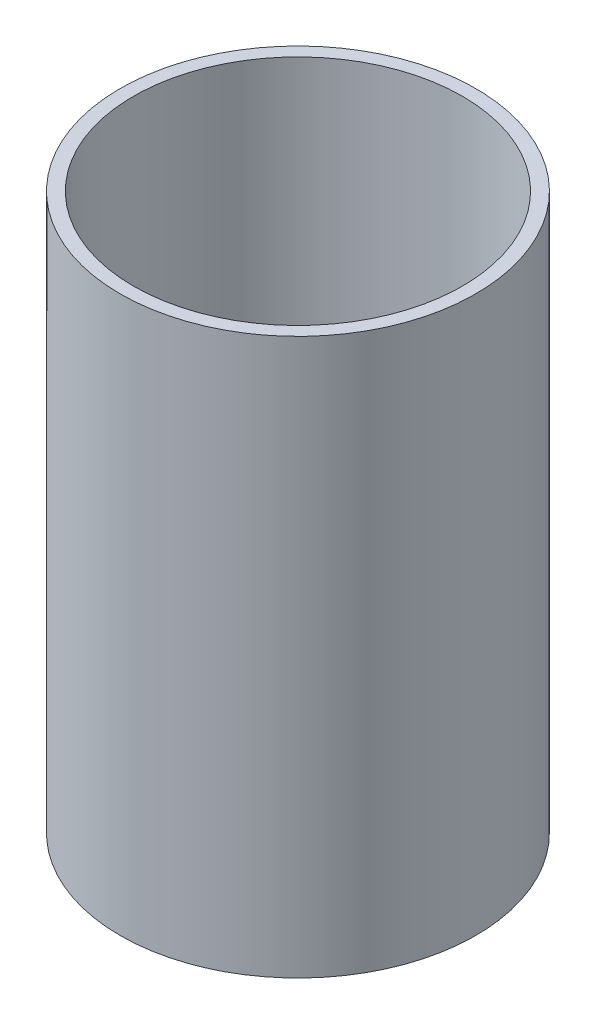
ISO-10303-21;
HEADER;
FILE_DESCRIPTION(('STEP AP214'),'2;1');
FILE_NAME('part.step','',(''),(''),'','','');
FILE_SCHEMA(('AUTOMOTIVE_DESIGN { 1 0 10303 214 1 1 1 1 }'));
ENDSEC;
DATA;
#1=APPLICATION_CONTEXT('core data for automotive mechanical design processes');
#2=APPLICATION_PROTOCOL_DEFINITION('international standard','automotive_design',2000,#1);
#3=PRODUCT_CONTEXT('',#1,'mechanical');
#4=PRODUCT('Part','Part','',(#3));
#5=PRODUCT_RELATED_PRODUCT_CATEGORY('part','',(#4));
#6=PRODUCT_DEFINITION_FORMATION('','',#4);
#7=PRODUCT_DEFINITION_CONTEXT('part definition',#1,'design');
#8=PRODUCT_DEFINITION('design','',#6,#7);
#9=PRODUCT_DEFINITION_SHAPE('','',#8);
#10=(LENGTH_UNIT() NAMED_UNIT(*) SI_UNIT(.MILLI.,.METRE.));
#11=(NAMED_UNIT(*) PLANE_ANGLE_UNIT() SI_UNIT($,.RADIAN.));
#12=(NAMED_UNIT(*) SI_UNIT($,.STERADIAN.) SOLID_ANGLE_UNIT());
#13=UNCERTAINTY_MEASURE_WITH_UNIT(LENGTH_MEASURE(1.E-05),#10,'distance_accuracy_value','');
#14=(GEOMETRIC_REPRESENTATION_CONTEXT(3) GLOBAL_UNCERTAINTY_ASSIGNED_CONTEXT((#13)) GLOBAL_UNIT_ASSIGNED_CONTEXT((#10,
#11,#12)) REPRESENTATION_CONTEXT('',''));
#15=CARTESIAN_POINT('',(0.,0.,0.));
#16=DIRECTION('',(0.,0.,1.));
#17=DIRECTION('',(1.,0.,0.));
#18=AXIS2_PLACEMENT_3D('',#15,#16,#17);
#19=CARTESIAN_POINT('',(0.,50.,0.));
#20=DIRECTION('',(0.,1.,0.));
#21=DIRECTION('',(0.,0.,1.));
#22=AXIS2_PLACEMENT_3D('',#19,#20,#21);
#23=PLANE('',#22);
#24=CARTESIAN_POINT('',(0.,50.,0.));
#25=DIRECTION('',(0.,1.,0.));
#26=DIRECTION('',(0.,0.,1.));
#27=AXIS2_PLACEMENT_3D('',#24,#25,#26);
#28=CIRCLE('',#27,16.);
#29=CARTESIAN_POINT('',(0.,50.,16.));
#30=VERTEX_POINT('',#29);
#31=EDGE_CURVE('E13',#30,#30,#28,.T.);
#32=ORIENTED_EDGE('',*,*,#31,.T.);
#33=EDGE_LOOP('',(#32));
#34=FACE_BOUND('',#33,.T.);
#35=CARTESIAN_POINT('',(0.,50.,0.));
#36=DIRECTION('',(0.,1.,0.));
#37=DIRECTION('',(0.,0.,1.));
#38=AXIS2_PLACEMENT_3D('',#35,#36,#37);
#39=CIRCLE('',#38,14.8);
#40=CARTESIAN_POINT('',(0.,50.,14.8));
#41=VERTEX_POINT('',#40);
#42=EDGE_CURVE('E111',#41,#41,#39,.T.);
#43=ORIENTED_EDGE('',*,*,#42,.F.);
#44=EDGE_LOOP('',(#43));
#45=FACE_BOUND('',#44,.T.);
#46=ADVANCED_FACE('F46',(#34,#45),#23,.T.);
#47=CARTESIAN_POINT('',(0.,0.,0.));
#48=DIRECTION('',(0.,1.,0.));
#49=DIRECTION('',(0.,0.,1.));
#50=AXIS2_PLACEMENT_3D('',#47,#48,#49);
#51=PLANE('',#50);
#52=CARTESIAN_POINT('',(0.,0.,0.));
#53=DIRECTION('',(0.,1.,0.));
#54=DIRECTION('',(0.,0.,1.));
#55=AXIS2_PLACEMENT_3D('',#52,#53,#54);
#56=CIRCLE('',#55,16.);
#57=CARTESIAN_POINT('',(0.,0.,16.));
#58=VERTEX_POINT('',#57);
#59=EDGE_CURVE('E57',#58,#58,#56,.T.);
#60=ORIENTED_EDGE('',*,*,#59,.F.);
#61=EDGE_LOOP('',(#60));
#62=FACE_BOUND('',#61,.T.);
#63=CARTESIAN_POINT('',(0.,0.,0.));
#64=DIRECTION('',(0.,1.,0.));
#65=DIRECTION('',(0.,0.,1.));
#66=AXIS2_PLACEMENT_3D('',#63,#64,#65);
#67=CIRCLE('',#66,14.8);
#68=CARTESIAN_POINT('',(0.,0.,14.8));
#69=VERTEX_POINT('',#68);
#70=EDGE_CURVE('E75',#69,#69,#67,.T.);
#71=ORIENTED_EDGE('',*,*,#70,.T.);
#72=EDGE_LOOP('',(#71));
#73=FACE_BOUND('',#72,.T.);
#74=ADVANCED_FACE('F122',(#62,#73),#51,.F.);
#75=CARTESIAN_POINT('',(0.,50.,0.));
#76=DIRECTION('',(0.,-1.,0.));
#77=DIRECTION('',(0.,0.,-1.));
#78=AXIS2_PLACEMENT_3D('',#75,#76,#77);
#79=CYLINDRICAL_SURFACE('',#78,16.);
#80=CARTESIAN_POINT('',(-16.,25.5,0.));
#81=CARTESIAN_POINT('',(-16.000000022161,25.5000003187984,0.00854419738761275));
#82=CARTESIAN_POINT('',(-15.9999931564576,25.4998130099911,0.0170893455640796));
#83=CARTESIAN_POINT('',(-15.9999660260618,25.4990511193298,0.0340217371802799));
#84=CARTESIAN_POINT('',(-15.9999459829687,25.4984829393989,0.042409271871736));
#85=CARTESIAN_POINT('',(-15.9998932472506,25.4969595173938,0.0590266862545256));
#86=CARTESIAN_POINT('',(-15.9998607424584,25.4960100132974,0.0672570871649991));
#87=CARTESIAN_POINT('',(-15.9997838534631,25.4937247592253,0.0835598397620271));
#88=CARTESIAN_POINT('',(-15.9997396220718,25.4923939611432,0.0916328838903904));
#89=CARTESIAN_POINT('',(-15.9996400278649,25.4893469225403,0.107620788280474));
#90=CARTESIAN_POINT('',(-15.9995847830799,25.4876347481539,0.115536422157899));
#91=CARTESIAN_POINT('',(-15.9994638980031,25.4838258910626,0.131209417614169));
#92=CARTESIAN_POINT('',(-15.9993983420339,25.4817323071844,0.138967531747529));
#93=CARTESIAN_POINT('',(-15.9992575545361,25.4771616313094,0.154325520551644));
#94=CARTESIAN_POINT('',(-15.9991823757573,25.4746866161569,0.161926013228417));
#95=CARTESIAN_POINT('',(-15.9990230463243,25.4693541261713,0.176968906553041));
#96=CARTESIAN_POINT('',(-15.9989389199814,25.4664976825634,0.184411672867422));
#97=CARTESIAN_POINT('',(-15.998762381644,25.4604033964034,0.199139382356899));
#98=CARTESIAN_POINT('',(-15.998669969555,25.4571655495002,0.206424323730403));
#99=CARTESIAN_POINT('',(-15.9984775276848,25.4503094958122,0.220836767729123));
#100=CARTESIAN_POINT('',(-15.9983774781479,25.4466902927126,0.227963795983825));
#101=CARTESIAN_POINT('',(-15.9981704104108,25.4390725099795,0.242060901892044));
#102=CARTESIAN_POINT('',(-15.9980633580033,25.4350720164771,0.249029944209711));
#103=CARTESIAN_POINT('',(-15.9978429142773,25.426692551113,0.262811650842644));
#104=CARTESIAN_POINT('',(-15.9977294796947,25.4223108479036,0.269622652399459));
#105=CARTESIAN_POINT('',(-15.9974968819047,25.4131697505162,0.28308891331842));
#106=CARTESIAN_POINT('',(-15.9973776716728,25.408406926401,0.289741841241404));
#107=CARTESIAN_POINT('',(-15.9971341139852,25.3985042535724,0.302892619724633));
#108=CARTESIAN_POINT('',(-15.9970097206926,25.3933604064378,0.309387454993219));
#109=CARTESIAN_POINT('',(-15.9967563683747,25.382696200712,0.322222746698452));
#110=CARTESIAN_POINT('',(-15.9966273690714,25.3771714085011,0.328559514270795));
#111=CARTESIAN_POINT('',(-15.9963653625106,25.3657457620264,0.341079260200018));
#112=CARTESIAN_POINT('',(-15.9962323242938,25.3598401702685,0.347257906702018));
#113=CARTESIAN_POINT('',(-15.995965104725,25.347758824547,0.359356318050322));
#114=CARTESIAN_POINT('',(-15.995830922448,25.341582831105,0.365275843737312));
#115=CARTESIAN_POINT('',(-15.9955652510334,25.3290678170494,0.376728792292628));
#116=CARTESIAN_POINT('',(-15.995433753916,25.3227331520779,0.382266966075001));
#117=CARTESIAN_POINT('',(-15.9951746685603,25.3099014704081,0.392957366584713));
#118=CARTESIAN_POINT('',(-15.9950470512844,25.3034081643703,0.398114041176149));
#119=CARTESIAN_POINT('',(-15.9947968482523,25.2902598598075,0.408041829027736));
#120=CARTESIAN_POINT('',(-15.9946742195514,25.283607895412,0.412816954802194));
#121=CARTESIAN_POINT('',(-15.9944350284272,25.2701429785383,0.42198213662288));
#122=CARTESIAN_POINT('',(-15.9943184167316,25.2633323731124,0.426375636065839));
#123=CARTESIAN_POINT('',(-15.9940922045334,25.2495508785582,0.434778198258726));
#124=CARTESIAN_POINT('',(-15.9939825562378,25.2425816643081,0.438790004513));
#125=CARTESIAN_POINT('',(-15.9937711262381,25.2284836354514,0.446429939693773));
#126=CARTESIAN_POINT('',(-15.9936693058566,25.2213558647338,0.450059992692729));
#127=CARTESIAN_POINT('',(-15.9934742977766,25.2069413565834,0.456937295402938));
#128=CARTESIAN_POINT('',(-15.9933810875823,25.1996550986081,0.460185549065969));
#129=CARTESIAN_POINT('',(-15.9932039774208,25.1849241747372,0.466300219481753));
#130=CARTESIAN_POINT('',(-15.9931200772366,25.1774795125409,0.469166645140295));
#131=CARTESIAN_POINT('',(-15.9929621772057,25.1624322426394,0.474518690189638));
#132=CARTESIAN_POINT('',(-15.9928882042066,25.1548292684014,0.477003279454266));
#133=CARTESIAN_POINT('',(-15.9927506626633,25.139465724794,0.481592713834051));
#134=CARTESIAN_POINT('',(-15.9926871512568,25.1317045343144,0.483695479551824));
#135=CARTESIAN_POINT('',(-15.992570952671,25.1160247890639,0.487522325762574));
#136=CARTESIAN_POINT('',(-15.9925183544561,25.1081054770057,0.489243301195504));
#137=CARTESIAN_POINT('',(-15.9924243194103,25.0921095966818,0.492307588840854));
#138=CARTESIAN_POINT('',(-15.9923830032194,25.0840322488844,0.493646825249004));
#139=CARTESIAN_POINT('',(-15.9923117884386,25.0677202992437,0.495948589392911));
#140=CARTESIAN_POINT('',(-15.9922820404495,25.0594849990285,0.496906152062965));
#141=CARTESIAN_POINT('',(-15.99223413886,25.0428570146902,0.498445431843923));
#142=CARTESIAN_POINT('',(-15.9922161627631,25.034463800945,0.499021396439908));
#143=CARTESIAN_POINT('',(-15.9921919035581,25.0175198917864,0.499798230430733));
#144=CARTESIAN_POINT('',(-15.9921858207397,25.0089689072466,0.499992674995636));
#145=CARTESIAN_POINT('',(-15.9921853735323,24.9918635521172,0.500006978516785));
#146=CARTESIAN_POINT('',(-15.992191013354,24.9833091814148,0.499826702878929));
#147=CARTESIAN_POINT('',(-15.9922144052116,24.966358007453,0.499077707362123));
#148=CARTESIAN_POINT('',(-15.992231956641,24.9579609253767,0.498515420862722));
#149=CARTESIAN_POINT('',(-15.9922790307901,24.9413247129481,0.497002984285436));
#150=CARTESIAN_POINT('',(-15.992308375657,24.9330850617688,0.496058595196808));
#151=CARTESIAN_POINT('',(-15.9923788085461,24.9167639204705,0.493782669284477));
#152=CARTESIAN_POINT('',(-15.9924197456204,24.9086817391578,0.49245610532357));
#153=CARTESIAN_POINT('',(-15.9925130491462,24.8926757037231,0.489416653498954));
#154=CARTESIAN_POINT('',(-15.9925652946367,24.8847510755998,0.487707848273403));
#155=CARTESIAN_POINT('',(-15.9926808165682,24.8690602118382,0.483904834790657));
#156=CARTESIAN_POINT('',(-15.9927440037755,24.8612932228332,0.481813737112032));
#157=CARTESIAN_POINT('',(-15.9928809275667,24.8459175974256,0.4772471325227));
#158=CARTESIAN_POINT('',(-15.9929546068173,24.8383083423323,0.474773708909914));
#159=CARTESIAN_POINT('',(-15.99311195161,24.8232480274751,0.469443490638924));
#160=CARTESIAN_POINT('',(-15.993195590201,24.8157966022696,0.466587728140051));
#161=CARTESIAN_POINT('',(-15.9933722108168,24.8010516704421,0.460493881478012));
#162=CARTESIAN_POINT('',(-15.9934651930595,24.7937581675063,0.457255788401966));
#163=CARTESIAN_POINT('',(-15.9936597800336,24.7793286885719,0.450398306390711));
#164=CARTESIAN_POINT('',(-15.9937614073722,24.772193191169,0.446777911371452));
#165=CARTESIAN_POINT('',(-15.9939724870204,24.7580792288502,0.43915679383885));
#166=CARTESIAN_POINT('',(-15.9940819782296,24.7511018063788,0.435154143002244));
#167=CARTESIAN_POINT('',(-15.9943079127154,24.7373034159238,0.426769395324044));
#168=CARTESIAN_POINT('',(-15.9944244041125,24.7304841210488,0.422384548700263));
#169=CARTESIAN_POINT('',(-15.9946633916092,24.7170013456874,0.413236178519962));
#170=CARTESIAN_POINT('',(-15.9947859374029,24.7103402103831,0.408469203431179));
#171=CARTESIAN_POINT('',(-15.9950360119347,24.6971730859816,0.398557223312308));
#172=CARTESIAN_POINT('',(-15.9951635841194,24.690670129256,0.39340819597349));
#173=CARTESIAN_POINT('',(-15.995422616607,24.6778186622624,0.38273260314162));
#174=CARTESIAN_POINT('',(-15.9955541065104,24.6714738610526,0.377201578677728));
#175=CARTESIAN_POINT('',(-15.9958198011672,24.6589381123953,0.365762422926971));
#176=CARTESIAN_POINT('',(-15.9959540145144,24.6527515196891,0.359849528167547));
#177=CARTESIAN_POINT('',(-15.9962215445409,24.6406389690711,0.347754173545306));
#178=CARTESIAN_POINT('',(-15.9963548605213,24.6347131979812,0.341571526578527));
#179=CARTESIAN_POINT('',(-15.9966174349553,24.6232485035666,0.329042902347089));
#180=CARTESIAN_POINT('',(-15.9967467240718,24.6177048156224,0.322701293520035));
#181=CARTESIAN_POINT('',(-15.9970006651948,24.6070041512641,0.309855423869267));
#182=CARTESIAN_POINT('',(-15.9971253573306,24.6018427139993,0.303354884215923));
#183=CARTESIAN_POINT('',(-15.9973695179776,24.5919061875677,0.290191812242));
#184=CARTESIAN_POINT('',(-15.9974890323114,24.5871270742357,0.283532322164332));
#185=CARTESIAN_POINT('',(-15.9977222397038,24.5779547247878,0.270052056250834));
#186=CARTESIAN_POINT('',(-15.9978359798723,24.5735580356722,0.263233633115859));
#187=CARTESIAN_POINT('',(-15.9980570321382,24.5651499213937,0.249436208980471));
#188=CARTESIAN_POINT('',(-15.9981643876427,24.5611357458592,0.242458886133561));
#189=CARTESIAN_POINT('',(-15.9983720548163,24.5534919176308,0.228344350741384));
#190=CARTESIAN_POINT('',(-15.9984724008431,24.5498603373565,0.22120818322399));
#191=CARTESIAN_POINT('',(-15.9986654247089,24.5429808421783,0.206776598080608));
#192=CARTESIAN_POINT('',(-15.9987581224064,24.5397319236736,0.199481659292142));
#193=CARTESIAN_POINT('',(-15.9989352166552,24.5336168004448,0.184733097550697));
#194=CARTESIAN_POINT('',(-15.9990196133011,24.5307505913541,0.177279476409374));
#195=CARTESIAN_POINT('',(-15.9991794636164,24.5253998690541,0.162214020355797));
#196=CARTESIAN_POINT('',(-15.9992548928202,24.5229163948242,0.154601816322336));
#197=CARTESIAN_POINT('',(-15.9993961569254,24.5183300915879,0.139219555017812));
#198=CARTESIAN_POINT('',(-15.9994619387229,24.5162293550609,0.131448873948056));
#199=CARTESIAN_POINT('',(-15.9995832465867,24.5124074756215,0.115749896922669));
#200=CARTESIAN_POINT('',(-15.9996386877416,24.5106894547729,0.107820841441572));
#201=CARTESIAN_POINT('',(-15.999738641067,24.5076319987836,0.0918052471723179));
#202=CARTESIAN_POINT('',(-15.9997830343601,24.5062966599879,0.083717927716659));
#203=CARTESIAN_POINT('',(-15.9998602086695,24.5040035932579,0.0673857773439029));
#204=CARTESIAN_POINT('',(-15.9998928357576,24.503050853492,0.0591402477976081));
#205=CARTESIAN_POINT('',(-15.9999457725054,24.5015222235121,0.0424917291997527));
#206=CARTESIAN_POINT('',(-15.9999658929445,24.5009521125315,0.034088214390616));
#207=CARTESIAN_POINT('',(-15.9999931294753,24.5001876174124,0.0171230091998738));
#208=CARTESIAN_POINT('',(-16.0000000223226,24.4999996801969,0.00856102507477903));
#209=CARTESIAN_POINT('',(-16.,24.5,0.));
#210=B_SPLINE_CURVE_WITH_KNOTS('',3,(#80,#81,#82,#83,#84,#85,#86,#87,#88,#89,#90,#91,#92,#93,
#94,#95,#96,#97,#98,#99,#100,#101,#102,#103,#104,#105,#106,#107,#108,#109,#110,#111,#112,#113,
#114,#115,#116,#117,#118,#119,#120,#121,#122,#123,#124,#125,#126,#127,#128,#129,#130,#131,#132,
#133,#134,#135,#136,#137,#138,#139,#140,#141,#142,#143,#144,#145,#146,#147,#148,#149,#150,#151,
#152,#153,#154,#155,#156,#157,#158,#159,#160,#161,#162,#163,#164,#165,#166,#167,#168,#169,#170,
#171,#172,#173,#174,#175,#176,#177,#178,#179,#180,#181,#182,#183,#184,#185,#186,#187,#188,#189,
#190,#191,#192,#193,#194,#195,#196,#197,#198,#199,#200,#201,#202,#203,#204,#205,#206,#207,#208,
#209),.UNSPECIFIED.,.F.,.F.,(4,2,2,2,2,2,2,2,2,2,2,2,2,2,2,2,2,2,2,2,2,2,2,2,2,2,2,2,2,2,2,2,2,
2,2,2,2,2,2,2,2,2,2,2,2,2,2,2,2,2,2,2,2,2,2,2,2,2,2,2,2,2,2,2,4),(0.,0.025631912027787,
0.0508434433342665,0.0756890252830576,0.100225524807038,0.124511980093613,0.148609267220651,
0.172579703562038,0.196486598486916,0.220393766168558,0.244365018602264,0.268463658709462,
0.292751993397137,0.31729088464986,0.342139353437058,0.367354246920536,0.392989974740767,
0.418648884948924,0.443885523524834,0.468754432115489,0.493312602586717,0.517619212675238,
0.541735292082074,0.565723324784329,0.589646798090552,0.61356971330594,0.637556076205322,
0.661669387328874,0.685972152132163,0.710525429233951,0.735388431696516,0.76061819194456,
0.786269296182489,0.81192961551979,0.837168168186901,0.86203959127481,0.88660097204888,
0.910911582037586,0.935032541468052,0.959026419915115,0.982956783790352,1.00688770563966,
1.03088325353706,1.0550069806557,1.0793214350814,1.10388770811015,1.12876503592976,
1.15401046523109,1.17967858853274,1.20536480780438,1.23062788565447,1.25552250951828,
1.28010582591459,1.30443717494427,1.32857775486669,1.35259022256963,1.37653824052871,
1.40048598522262,1.42449763532072,1.44863685978375,1.47296632602603,1.49754724647846,
1.52243897855194,1.54769868863736,1.57338108599854),.UNSPECIFIED.);
#211=CARTESIAN_POINT('',(-16.,25.5,0.));
#212=VERTEX_POINT('',#211);
#213=CARTESIAN_POINT('',(-16.,24.5,0.));
#214=VERTEX_POINT('',#213);
#215=EDGE_CURVE('E67',#212,#214,#210,.T.);
#216=ORIENTED_EDGE('',*,*,#215,.T.);
#217=CARTESIAN_POINT('',(-16.,24.5,0.));
#218=CARTESIAN_POINT('',(-16.000000022262,24.4999996805724,-0.00855471933840169));
#219=CARTESIAN_POINT('',(-15.9999931395924,24.5001873822521,-0.0171103946253763));
#220=CARTESIAN_POINT('',(-15.9999659428568,24.5009509011428,-0.0340633040891813));
#221=CARTESIAN_POINT('',(-15.9999458514175,24.5015202883175,-0.0424608310740263));
#222=CARTESIAN_POINT('',(-15.9998929900412,24.5030469661916,-0.0590976951080111));
#223=CARTESIAN_POINT('',(-15.9998604088039,24.5039984931405,-0.0673375562107661));
#224=CARTESIAN_POINT('',(-15.9997833414602,24.5062886314509,-0.0836586920862067));
#225=CARTESIAN_POINT('',(-15.999739008863,24.5076222682585,-0.0917406631647915));
#226=CARTESIAN_POINT('',(-15.9996391901643,24.510675819497,-0.10774588355027));
#227=CARTESIAN_POINT('',(-15.9995838226223,24.5123916489219,-0.115669910876577));
#228=CARTESIAN_POINT('',(-15.9994626732423,24.5162086471916,-0.131359154786923));
#229=CARTESIAN_POINT('',(-15.9993969760948,24.5183067026946,-0.139125128278526));
#230=CARTESIAN_POINT('',(-15.9992558906348,24.5228871483231,-0.154498297521504));
#231=CARTESIAN_POINT('',(-15.9991805552934,24.5253674518378,-0.162106114896058));
#232=CARTESIAN_POINT('',(-15.9990209002026,24.5307113401143,-0.177163120205625));
#233=CARTESIAN_POINT('',(-15.9989366048608,24.5335738888071,-0.184612675964353));
#234=CARTESIAN_POINT('',(-15.9987597189464,24.5396812016719,-0.19935342854353));
#235=CARTESIAN_POINT('',(-15.9986671282791,24.5429259702046,-0.206644623556094));
#236=CARTESIAN_POINT('',(-15.9984743225011,24.5497966788011,-0.221069041358284));
#237=CARTESIAN_POINT('',(-15.9983740875704,24.553423619731,-0.228201786988074));
#238=CARTESIAN_POINT('',(-15.9981666449952,24.5610576853256,-0.242309797057877));
#239=CARTESIAN_POINT('',(-15.9980594030493,24.5650667324249,-0.249284020109909));
#240=CARTESIAN_POINT('',(-15.9978385787632,24.573464108203,-0.26307556109965));
#241=CARTESIAN_POINT('',(-15.9977249530694,24.5778551801143,-0.269891206665696));
#242=CARTESIAN_POINT('',(-15.9974919740249,24.5870158154289,-0.283366231666006));
#243=CARTESIAN_POINT('',(-15.9973725735959,24.5917888231805,-0.290023266382026));
#244=CARTESIAN_POINT('',(-15.997128638762,24.6017126599509,-0.303181739835065));
#245=CARTESIAN_POINT('',(-15.9970040585284,24.6068675034705,-0.309680146456485));
#246=CARTESIAN_POINT('',(-15.9967503379116,24.6175545032212,-0.322522059454275));
#247=CARTESIAN_POINT('',(-15.9966211573435,24.6230911101195,-0.328861856757062));
#248=CARTESIAN_POINT('',(-15.9963587953925,24.6345411636729,-0.341387168018073));
#249=CARTESIAN_POINT('',(-15.9962255832319,24.6404593646446,-0.347568327414076));
#250=CARTESIAN_POINT('',(-15.9959582748072,24.6525554823713,-0.35966006111605));
#251=CARTESIAN_POINT('',(-15.9958241794337,24.6587331637218,-0.365570870933265));
#252=CARTESIAN_POINT('',(-15.9955587010261,24.6712511327441,-0.377006670002481));
#253=CARTESIAN_POINT('',(-15.9954273096448,24.6775870772484,-0.382536404742403));
#254=CARTESIAN_POINT('',(-15.9951684516048,24.6904208733648,-0.393210233310301));
#255=CARTESIAN_POINT('',(-15.9950409556567,24.6969150257235,-0.398358768962465));
#256=CARTESIAN_POINT('',(-15.9947910085568,24.7100645864378,-0.408270579098139));
#257=CARTESIAN_POINT('',(-15.9946685143003,24.7167169702677,-0.413037860218157));
#258=CARTESIAN_POINT('',(-15.9944296027464,24.7301822896318,-0.422187654300824));
#259=CARTESIAN_POINT('',(-15.9943131360929,24.7369928858381,-0.426573605202532));
#260=CARTESIAN_POINT('',(-15.9940872222558,24.7507739280232,-0.434961370886434));
#261=CARTESIAN_POINT('',(-15.9939777272503,24.7577427048369,-0.438965924546218));
#262=CARTESIAN_POINT('',(-15.9937666098393,24.7718394268546,-0.446591654249477));
#263=CARTESIAN_POINT('',(-15.9936649487602,24.778966331864,-0.450214750948633));
#264=CARTESIAN_POINT('',(-15.9934702631783,24.7933786787282,-0.457078439384892));
#265=CARTESIAN_POINT('',(-15.9933772161927,24.8006636428876,-0.46032003321688));
#266=CARTESIAN_POINT('',(-15.9932004343758,24.815391551192,-0.46642168061217));
#267=CARTESIAN_POINT('',(-15.9931166993275,24.8228344916504,-0.469281743067595));
#268=CARTESIAN_POINT('',(-15.992959129678,24.8378778918707,-0.474621356393291));
#269=CARTESIAN_POINT('',(-15.9928853218921,24.84547871669,-0.477099879160133));
#270=CARTESIAN_POINT('',(-15.9927481092111,24.8608375366908,-0.481677473125359));
#271=CARTESIAN_POINT('',(-15.9926847613739,24.868596150335,-0.483774469072948));
#272=CARTESIAN_POINT('',(-15.9925688868314,24.8842703182428,-0.487590066108946));
#273=CARTESIAN_POINT('',(-15.9925164489523,24.892186626316,-0.48930556838502));
#274=CARTESIAN_POINT('',(-15.9924227300796,24.9081760757443,-0.492359198160132));
#275=CARTESIAN_POINT('',(-15.9923815695242,24.916249992662,-0.493693258081731));
#276=CARTESIAN_POINT('',(-15.99231066027,24.9325546580057,-0.495984955046345));
#277=CARTESIAN_POINT('',(-15.9922810619061,24.9407861006533,-0.496937637010669));
#278=CARTESIAN_POINT('',(-15.9922334525981,24.9574059474617,-0.49846744212419));
#279=CARTESIAN_POINT('',(-15.9922156188297,24.9657948771773,-0.499038824282931));
#280=CARTESIAN_POINT('',(-15.9921916366071,24.9827297955422,-0.499806768556201));
#281=CARTESIAN_POINT('',(-15.9921856880664,24.991276069539,-0.499996918394272));
#282=CARTESIAN_POINT('',(-15.9921854972578,25.0083765335516,-0.500003021306972));
#283=CARTESIAN_POINT('',(-15.9921912656526,25.0169307236904,-0.499818633537284));
#284=CARTESIAN_POINT('',(-15.9922149109203,25.0338813543315,-0.499061505403673));
#285=CARTESIAN_POINT('',(-15.9922325872175,25.0422780767358,-0.498495197891006));
#286=CARTESIAN_POINT('',(-15.9922799068371,25.0589133883411,-0.49697480053446));
#287=CARTESIAN_POINT('',(-15.9923093723462,25.0671525011116,-0.496026471224033));
#288=CARTESIAN_POINT('',(-15.9923800413569,25.0834723843633,-0.493742748919821));
#289=CARTESIAN_POINT('',(-15.9924210939594,25.0915538483937,-0.492412328241206));
#290=CARTESIAN_POINT('',(-15.9925146226291,25.107558268473,-0.489365246338859));
#291=CARTESIAN_POINT('',(-15.9925669777864,25.1154820004451,-0.487652667209062));
#292=CARTESIAN_POINT('',(-15.9926827124028,25.1311708915582,-0.483842189439045));
#293=CARTESIAN_POINT('',(-15.9927460026756,25.138936805521,-0.481747400880993));
#294=CARTESIAN_POINT('',(-15.9928831252624,25.1543101009827,-0.477173497925582));
#295=CARTESIAN_POINT('',(-15.9929569002805,25.1619181021401,-0.474696466438065));
#296=CARTESIAN_POINT('',(-15.9931144286264,25.1769757297624,-0.469359115688528));
#297=CARTESIAN_POINT('',(-15.9931981550241,25.1844257221446,-0.466499828364172));
#298=CARTESIAN_POINT('',(-15.9933749426669,25.1991676094597,-0.460399015127132));
#299=CARTESIAN_POINT('',(-15.9934680041297,25.2064595007014,-0.457157480301385));
#300=CARTESIAN_POINT('',(-15.993662740393,25.2208855778658,-0.450293197629074));
#301=CARTESIAN_POINT('',(-15.9937644377751,25.228019284734,-0.446669443967709));
#302=CARTESIAN_POINT('',(-15.9939756478348,25.242129488039,-0.439041691694729));
#303=CARTESIAN_POINT('',(-15.9940851993576,25.2491049411591,-0.435035765336377));
#304=CARTESIAN_POINT('',(-15.994311244308,25.2628992154125,-0.426644548882674));
#305=CARTESIAN_POINT('',(-15.9944277857711,25.2697163622034,-0.422256509915048));
#306=CARTESIAN_POINT('',(-15.9946668627911,25.2831946640847,-0.413101836832218));
#307=CARTESIAN_POINT('',(-15.9947894479259,25.2898534724539,-0.408331752438937));
#308=CARTESIAN_POINT('',(-15.9950395901053,25.3030157665695,-0.398413635721207));
#309=CARTESIAN_POINT('',(-15.9951671904498,25.3095162181711,-0.39326158269451));
#310=CARTESIAN_POINT('',(-15.9954262678898,25.3223624964044,-0.382580018019212));
#311=CARTESIAN_POINT('',(-15.9955577744113,25.3287046119923,-0.377046049308593));
#312=CARTESIAN_POINT('',(-15.9958234904126,25.3412348199016,-0.365601092471954));
#313=CARTESIAN_POINT('',(-15.995957708283,25.3474185555214,-0.359685343227504));
#314=CARTESIAN_POINT('',(-15.9962251493788,25.3595213274013,-0.347588296839516));
#315=CARTESIAN_POINT('',(-15.9963583725461,25.3654403483104,-0.341406984336468));
#316=CARTESIAN_POINT('',(-15.9966207572313,25.376891979742,-0.328881321559029));
#317=CARTESIAN_POINT('',(-15.9967499495114,25.3824293458233,-0.322541327483004));
#318=CARTESIAN_POINT('',(-15.9970036938648,25.3931178126593,-0.309698987458372));
#319=CARTESIAN_POINT('',(-15.9971282861178,25.398273365144,-0.303200351848148));
#320=CARTESIAN_POINT('',(-15.9973722452191,25.4081985657822,-0.290041384092215));
#321=CARTESIAN_POINT('',(-15.9974916578952,25.4129722294815,-0.283384085156907));
#322=CARTESIAN_POINT('',(-15.9977246614872,25.4221341234342,-0.269908496413283));
#323=CARTESIAN_POINT('',(-15.9978382994849,25.4265257989636,-0.263092552178483));
#324=CARTESIAN_POINT('',(-15.9980591482743,25.4349243286517,-0.249300378576706));
#325=CARTESIAN_POINT('',(-15.9981664024256,25.4389339268101,-0.242325822202367));
#326=CARTESIAN_POINT('',(-15.99837386914,25.4465690414262,-0.228217110511442));
#327=CARTESIAN_POINT('',(-15.9984741160105,25.4501964808712,-0.221083996973488));
#328=CARTESIAN_POINT('',(-15.9986669452262,25.4570681336167,-0.206658808596815));
#329=CARTESIAN_POINT('',(-15.9987595473957,25.4603133480771,-0.199367211098024));
#330=CARTESIAN_POINT('',(-15.9989364556985,25.466421500191,-0.184625619001913));
#331=CARTESIAN_POINT('',(-15.9990207619265,25.469284442206,-0.177175626212884));
#332=CARTESIAN_POINT('',(-15.9991804379959,25.4746290648211,-0.162117712472394));
#333=CARTESIAN_POINT('',(-15.9992557834233,25.4771097090398,-0.154509423557945));
#334=CARTESIAN_POINT('',(-15.9993968880795,25.4816907840877,-0.139135276997684));
#335=CARTESIAN_POINT('',(-15.9994625943228,25.4837891276761,-0.131368797495171));
#336=CARTESIAN_POINT('',(-15.9995837607317,25.4876066504438,-0.115678507409712));
#337=CARTESIAN_POINT('',(-15.9996391361832,25.4893227153448,-0.107753939638186));
#338=CARTESIAN_POINT('',(-15.999738969347,25.4923766861618,-0.0917476042502966));
#339=CARTESIAN_POINT('',(-15.9997833084656,25.4937105058542,-0.0836650583302523));
#340=CARTESIAN_POINT('',(-15.9998603873019,25.4960009588331,-0.0673427386417759));
#341=CARTESIAN_POINT('',(-15.9998929734654,25.4969526161038,-0.0591022683180332));
#342=CARTESIAN_POINT('',(-15.9999458429396,25.4984795037383,-0.0424641517191088));
#343=CARTESIAN_POINT('',(-15.9999659374945,25.4990489686888,-0.0340659812073778));
#344=CARTESIAN_POINT('',(-15.9999931385055,25.4998125924786,-0.017111750309025));
#345=CARTESIAN_POINT('',(-16.0000000222685,25.500000319468,-0.00855539701395401));
#346=CARTESIAN_POINT('',(-16.,25.5,-4.5180819856851E-13));
#347=B_SPLINE_CURVE_WITH_KNOTS('',3,(#217,#218,#219,#220,#221,#222,#223,#224,#225,#226,#227,
#228,#229,#230,#231,#232,#233,#234,#235,#236,#237,#238,#239,#240,#241,#242,#243,#244,#245,#246,
#247,#248,#249,#250,#251,#252,#253,#254,#255,#256,#257,#258,#259,#260,#261,#262,#263,#264,#265,
#266,#267,#268,#269,#270,#271,#272,#273,#274,#275,#276,#277,#278,#279,#280,#281,#282,#283,#284,
#285,#286,#287,#288,#289,#290,#291,#292,#293,#294,#295,#296,#297,#298,#299,#300,#301,#302,#303,
#304,#305,#306,#307,#308,#309,#310,#311,#312,#313,#314,#315,#316,#317,#318,#319,#320,#321,#322,
#323,#324,#325,#326,#327,#328,#329,#330,#331,#332,#333,#334,#335,#336,#337,#338,#339,#340,#341,
#342,#343,#344,#345,#346),.UNSPECIFIED.,.F.,.F.,(4,2,2,2,2,2,2,2,2,2,2,2,2,2,2,2,2,2,2,2,2,2,2,
2,2,2,2,2,2,2,2,2,2,2,2,2,2,2,2,2,2,2,2,2,2,2,2,2,2,2,2,2,2,2,2,2,2,2,2,2,2,2,2,2,4),(0.,
0.025663479294087,0.0509051365030669,0.0757795766719872,0.100343853878629,0.124657205798469,
0.148780718693917,0.172776928670097,0.196709369791052,0.220642083987319,0.244639111003444,
0.268763978432425,0.293079211875163,0.317645883451888,0.342523213562507,0.367768236450526,
0.393435535371941,0.419080031271405,0.444302913754301,0.46915864528719,0.493704132407897,
0.517998461886039,0.542102567565226,0.566078833653669,0.589990644956353,0.613901898863442,
0.637876497224025,0.661977838043497,0.686268326958353,0.710808926663719,0.735658759175766,
0.760874771503208,0.786511470576752,0.812171510532087,0.83740979705357,0.862280965657917,
0.886842101912137,0.911152475532428,0.935273204834662,0.959266857403032,0.983196997602724,
1.00712769590418,1.03112301830499,1.05524651592919,1.07956073486755,1.10412676449875,
1.12900383919097,1.15424900392819,1.17991684964525,1.20558618192973,1.2308331452278,
1.25571233398681,1.2802807945107,1.30459776005707,1.3287243162948,1.35272300292608,
1.37665736203111,1.40059144804042,1.42458931757091,1.44871451917541,1.47302960306269,
1.497595669047,1.52247196766519,1.54771556505957,1.57338107747077),.UNSPECIFIED.);
#348=EDGE_CURVE('E64',#214,#212,#347,.T.);
#349=ORIENTED_EDGE('',*,*,#348,.T.);
#350=EDGE_LOOP('',(#216,#349));
#351=FACE_BOUND('',#350,.T.);
#352=ORIENTED_EDGE('',*,*,#31,.F.);
#353=EDGE_LOOP('',(#352));
#354=FACE_BOUND('',#353,.T.);
#355=ORIENTED_EDGE('',*,*,#59,.T.);
#356=EDGE_LOOP('',(#355));
#357=FACE_BOUND('',#356,.T.);
#358=ADVANCED_FACE('F48',(#351,#354,#357),#79,.T.);
#359=CARTESIAN_POINT('',(0.,50.,0.));
#360=DIRECTION('',(0.,-1.,0.));
#361=DIRECTION('',(0.,0.,-1.));
#362=AXIS2_PLACEMENT_3D('',#359,#360,#361);
#363=CYLINDRICAL_SURFACE('',#362,14.8);
#364=CARTESIAN_POINT('',(-14.7915516427453,25.,-0.5));
#365=CARTESIAN_POINT('',(-14.7915517566634,25.0280766199162,-0.49999875755374));
#366=CARTESIAN_POINT('',(-14.7916324420957,25.05617339406,-0.497627171478576));
#367=CARTESIAN_POINT('',(-14.7919465404272,25.111592552611,-0.488199684657953));
#368=CARTESIAN_POINT('',(-14.7921801353814,25.1389139733702,-0.481138199943859));
#369=CARTESIAN_POINT('',(-14.7927735613068,25.1919715585838,-0.462532698877178));
#370=CARTESIAN_POINT('',(-14.7931333301223,25.2177084962607,-0.450990889322096));
#371=CARTESIAN_POINT('',(-14.7939384857358,25.2668723908831,-0.4237555675424));
#372=CARTESIAN_POINT('',(-14.7943838517307,25.2902999070126,-0.408063063738265));
#373=CARTESIAN_POINT('',(-14.7953102973675,25.3341997631918,-0.372962007589261));
#374=CARTESIAN_POINT('',(-14.7957913933864,25.354670735278,-0.353551744674618));
#375=CARTESIAN_POINT('',(-14.7967349273682,25.392064856387,-0.311569263972028));
#376=CARTESIAN_POINT('',(-14.7971973645846,25.4089878635972,-0.288996919855285));
#377=CARTESIAN_POINT('',(-14.7980515493542,25.4388082666022,-0.241325361077519));
#378=CARTESIAN_POINT('',(-14.7984432812927,25.4517047736371,-0.216225590158105));
#379=CARTESIAN_POINT('',(-14.7991117610834,25.4731003335709,-0.164215619073914));
#380=CARTESIAN_POINT('',(-14.7993885094581,25.4815994064563,-0.137305427138165));
#381=CARTESIAN_POINT('',(-14.7997957325133,25.4939557123661,-0.0824494596264798));
#382=CARTESIAN_POINT('',(-14.7999262634456,25.4978147305285,-0.0545040865770954));
#383=CARTESIAN_POINT('',(-14.800026526851,25.5007868856249,0.00163810303618265));
#384=CARTESIAN_POINT('',(-14.7999962600596,25.4999000442716,0.029834918449118));
#385=CARTESIAN_POINT('',(-14.7997783875936,25.4934071549584,0.0856674974818205));
#386=CARTESIAN_POINT('',(-14.7995908461187,25.4878030325942,0.11330348531831));
#387=CARTESIAN_POINT('',(-14.7990796328164,25.4720376419384,0.167242196367867));
#388=CARTESIAN_POINT('',(-14.7987559606486,25.4618763622502,0.19354491624652));
#389=CARTESIAN_POINT('',(-14.7980088518104,25.4372828915558,0.244076651240263));
#390=CARTESIAN_POINT('',(-14.7975853945486,25.4228498188754,0.26830523693338));
#391=CARTESIAN_POINT('',(-14.7966864328711,25.3901231172059,0.313996235844716));
#392=CARTESIAN_POINT('',(-14.7962109282988,25.3718294766106,0.335458640746527));
#393=CARTESIAN_POINT('',(-14.7952611734188,25.3318900313428,0.375019264835017));
#394=CARTESIAN_POINT('',(-14.7947869238566,25.3102425559773,0.39311579739148));
#395=CARTESIAN_POINT('',(-14.7938933851782,25.264215823252,0.425417995761406));
#396=CARTESIAN_POINT('',(-14.7934740960719,25.2398365654101,0.439623660887944));
#397=CARTESIAN_POINT('',(-14.7927377742171,25.1890373480067,0.463740698820046));
#398=CARTESIAN_POINT('',(-14.7924207428022,25.1626173618389,0.473652015626197));
#399=CARTESIAN_POINT('',(-14.7919247396563,25.1084870909673,0.488897918490848));
#400=CARTESIAN_POINT('',(-14.7917457674492,25.0807768107122,0.494232520327916));
#401=CARTESIAN_POINT('',(-14.7915461498085,25.0248672240016,0.500171491188929));
#402=CARTESIAN_POINT('',(-14.7915254261422,24.9966681660927,0.500778197524674));
#403=CARTESIAN_POINT('',(-14.7916444382309,24.940568603275,0.497250247400919));
#404=CARTESIAN_POINT('',(-14.7917841737481,24.9126680979238,0.493115597969097));
#405=CARTESIAN_POINT('',(-14.7922082809451,24.8579641641911,0.480224240349053));
#406=CARTESIAN_POINT('',(-14.79249261935,24.8311604849482,0.471468595494578));
#407=CARTESIAN_POINT('',(-14.7931738514587,24.7794033573613,0.449584866082624));
#408=CARTESIAN_POINT('',(-14.7935707454534,24.7544499137989,0.436456770226076));
#409=CARTESIAN_POINT('',(-14.7944325391183,24.707090831853,0.406194777882024));
#410=CARTESIAN_POINT('',(-14.794897465476,24.6846861994698,0.389059307806115));
#411=CARTESIAN_POINT('',(-14.7958428194113,24.6430708332836,0.351271289283769));
#412=CARTESIAN_POINT('',(-14.7963232470372,24.6238601094781,0.33061872982871));
#413=CARTESIAN_POINT('',(-14.7972456740927,24.5891700750504,0.286372769028095));
#414=CARTESIAN_POINT('',(-14.7976876579503,24.5736922719991,0.262778185337891));
#415=CARTESIAN_POINT('',(-14.7984831542424,24.5469177438538,0.213323963136452));
#416=CARTESIAN_POINT('',(-14.7988366669044,24.5356210080079,0.187464330450168));
#417=CARTESIAN_POINT('',(-14.7994152976475,24.5175319310325,0.134219743122368));
#418=CARTESIAN_POINT('',(-14.7996404435133,24.5107386150963,0.106835119971185));
#419=CARTESIAN_POINT('',(-14.7999370721243,24.5018460193117,0.0513132148063346));
#420=CARTESIAN_POINT('',(-14.8000085551143,24.4997467319809,0.0231759339925058));
#421=CARTESIAN_POINT('',(-14.7999898021353,24.5003018946022,-0.0330375258862938));
#422=CARTESIAN_POINT('',(-14.799899646889,24.5029539717052,-0.0611137284435592));
#423=CARTESIAN_POINT('',(-14.7995679331354,24.5129316950592,-0.116422124612186));
#424=CARTESIAN_POINT('',(-14.7993263743302,24.5202573505088,-0.143654316562241));
#425=CARTESIAN_POINT('',(-14.7987190572301,24.5393739086846,-0.196502458049538));
#426=CARTESIAN_POINT('',(-14.7983532969762,24.5511648818439,-0.222118382085338));
#427=CARTESIAN_POINT('',(-14.797538777301,24.578876687025,-0.271006681266259));
#428=CARTESIAN_POINT('',(-14.7970900208128,24.5947973731117,-0.29427913918406));
#429=CARTESIAN_POINT('',(-14.7961598285133,24.6303241564226,-0.337831101329746));
#430=CARTESIAN_POINT('',(-14.7956783799414,24.6499316980706,-0.358109426948954));
#431=CARTESIAN_POINT('',(-14.7947370840378,24.6922785708655,-0.395092185962291));
#432=CARTESIAN_POINT('',(-14.7942772420792,24.7150186755316,-0.411795734032196));
#433=CARTESIAN_POINT('',(-14.7934308357035,24.7629954091002,-0.441158370845388));
#434=CARTESIAN_POINT('',(-14.7930443224244,24.7882337616985,-0.453814641288737));
#435=CARTESIAN_POINT('',(-14.7923890704039,24.8404590330813,-0.474695435401524));
#436=CARTESIAN_POINT('',(-14.7921201914914,24.8674438265594,-0.482925236275071));
#437=CARTESIAN_POINT('',(-14.7918023000246,24.912165552592,-0.492541856111923));
#438=CARTESIAN_POINT('',(-14.7917087128431,24.9296122927642,-0.49533513318285));
#439=CARTESIAN_POINT('',(-14.7915833484038,24.9647033664365,-0.499064595351815));
#440=CARTESIAN_POINT('',(-14.7915515711227,24.9823476998623,-0.500000781149382));
#441=CARTESIAN_POINT('',(-14.7915516427453,25.,-0.5));
#442=B_SPLINE_CURVE_WITH_KNOTS('',3,(#364,#365,#366,#367,#368,#369,#370,#371,#372,#373,#374,
#375,#376,#377,#378,#379,#380,#381,#382,#383,#384,#385,#386,#387,#388,#389,#390,#391,#392,#393,
#394,#395,#396,#397,#398,#399,#400,#401,#402,#403,#404,#405,#406,#407,#408,#409,#410,#411,#412,
#413,#414,#415,#416,#417,#418,#419,#420,#421,#422,#423,#424,#425,#426,#427,#428,#429,#430,#431,
#432,#433,#434,#435,#436,#437,#438,#439,#440,#441),.UNSPECIFIED.,.T.,.F.,(4,2,2,2,2,2,2,2,2,2,2,
2,2,2,2,2,2,2,2,2,2,2,2,2,2,2,2,2,2,2,2,2,2,2,2,2,2,2,4),(0.,0.0841654258730178,
0.168431242328989,0.252655605960586,0.336859525859588,0.421102282109393,0.505348404914961,
0.589613110045995,0.673877432188874,0.758109325483999,0.842340833411699,0.926537974673514,
1.01073532649636,1.09495006831707,1.17916506332003,1.26342214521864,1.34767924199264,
1.43193743746788,1.5161953424555,1.60041159053749,1.68462771379361,1.76882446658539,
1.85302143695591,1.93725152489737,2.02148187648704,2.10574618844931,2.19001028371816,
2.27425613328596,2.35850184856234,2.44270550294126,2.52690932305165,2.61111447139613,
2.69531664451839,2.77955187507725,2.8638079431315,2.94812255532621,3.03233642419869,
3.08525283375237,3.13816922337348),.UNSPECIFIED.);
#443=CARTESIAN_POINT('',(-14.7915516427453,25.,-0.5));
#444=VERTEX_POINT('',#443);
#445=EDGE_CURVE('E72',#444,#444,#442,.T.);
#446=ORIENTED_EDGE('',*,*,#445,.F.);
#447=EDGE_LOOP('',(#446));
#448=FACE_BOUND('',#447,.T.);
#449=ORIENTED_EDGE('',*,*,#42,.T.);
#450=EDGE_LOOP('',(#449));
#451=FACE_BOUND('',#450,.T.);
#452=ORIENTED_EDGE('',*,*,#70,.F.);
#453=EDGE_LOOP('',(#452));
#454=FACE_BOUND('',#453,.T.);
#455=ADVANCED_FACE('F92',(#448,#451,#454),#363,.F.);
#456=CARTESIAN_POINT('',(-16.,25.,0.));
#457=DIRECTION('',(1.,0.,0.));
#458=DIRECTION('',(0.,0.,-1.));
#459=AXIS2_PLACEMENT_3D('',#456,#457,#458);
#460=CYLINDRICAL_SURFACE('',#459,0.5);
#461=ORIENTED_EDGE('',*,*,#445,.T.);
#462=EDGE_LOOP('',(#461));
#463=FACE_BOUND('',#462,.T.);
#464=ORIENTED_EDGE('',*,*,#215,.F.);
#465=ORIENTED_EDGE('',*,*,#348,.F.);
#466=EDGE_LOOP('',(#464,#465));
#467=FACE_BOUND('',#466,.T.);
#468=ADVANCED_FACE('F69',(#463,#467),#460,.F.);
#469=CLOSED_SHELL('',(#46,#74,#358,#455,#468));
#470=MANIFOLD_SOLID_BREP('B2',#469);
#471=ADVANCED_BREP_SHAPE_REPRESENTATION('',(#18,#470),#14);
#472=SHAPE_DEFINITION_REPRESENTATION(#9,#471);
ENDSEC;
END-ISO-10303-21;
